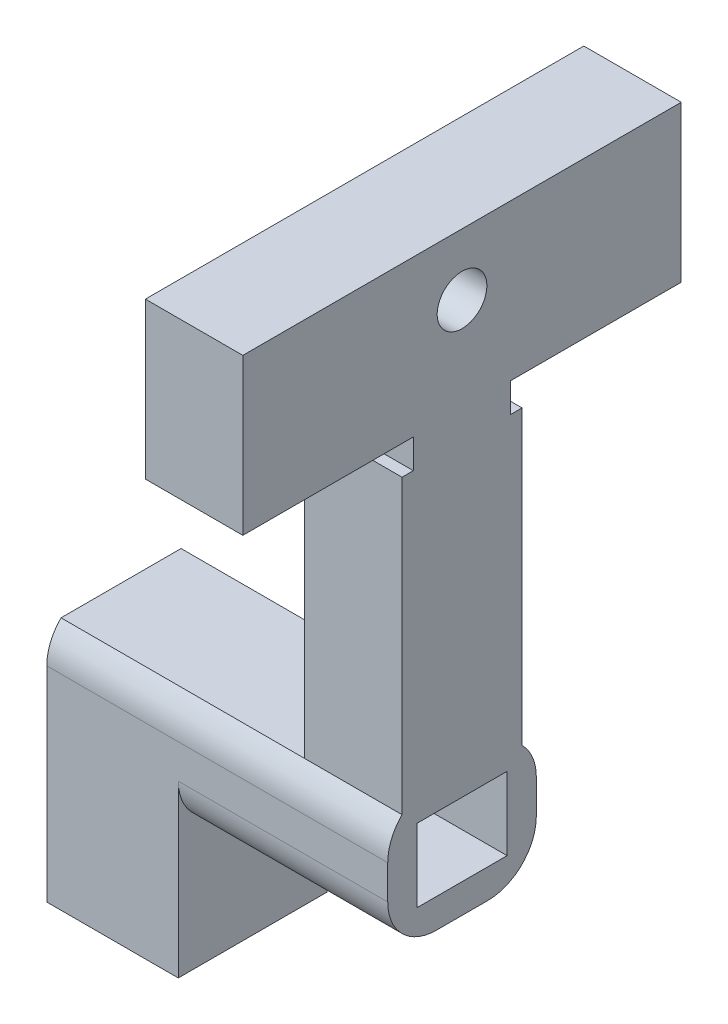
ISO-10303-21;
HEADER;
FILE_DESCRIPTION(('STEP AP214'),'2;1');
FILE_NAME('part.step','',(''),(''),'','','');
FILE_SCHEMA(('AUTOMOTIVE_DESIGN { 1 0 10303 214 1 1 1 1 }'));
ENDSEC;
DATA;
#1=APPLICATION_CONTEXT('core data for automotive mechanical design processes');
#2=APPLICATION_PROTOCOL_DEFINITION('international standard','automotive_design',2000,#1);
#3=PRODUCT_CONTEXT('',#1,'mechanical');
#4=PRODUCT('Part','Part','',(#3));
#5=PRODUCT_RELATED_PRODUCT_CATEGORY('part','',(#4));
#6=PRODUCT_DEFINITION_FORMATION('','',#4);
#7=PRODUCT_DEFINITION_CONTEXT('part definition',#1,'design');
#8=PRODUCT_DEFINITION('design','',#6,#7);
#9=PRODUCT_DEFINITION_SHAPE('','',#8);
#10=(LENGTH_UNIT() NAMED_UNIT(*) SI_UNIT(.MILLI.,.METRE.));
#11=(NAMED_UNIT(*) PLANE_ANGLE_UNIT() SI_UNIT($,.RADIAN.));
#12=(NAMED_UNIT(*) SI_UNIT($,.STERADIAN.) SOLID_ANGLE_UNIT());
#13=UNCERTAINTY_MEASURE_WITH_UNIT(LENGTH_MEASURE(1.E-05),#10,'distance_accuracy_value','');
#14=(GEOMETRIC_REPRESENTATION_CONTEXT(3) GLOBAL_UNCERTAINTY_ASSIGNED_CONTEXT((#13)) GLOBAL_UNIT_ASSIGNED_CONTEXT((#10,
#11,#12)) REPRESENTATION_CONTEXT('',''));
#15=CARTESIAN_POINT('',(0.,0.,0.));
#16=DIRECTION('',(0.,0.,1.));
#17=DIRECTION('',(1.,0.,0.));
#18=AXIS2_PLACEMENT_3D('',#15,#16,#17);
#19=CARTESIAN_POINT('',(10.,-13.5,0.));
#20=DIRECTION('',(0.,1.,0.));
#21=DIRECTION('',(0.,0.,1.));
#22=AXIS2_PLACEMENT_3D('',#19,#20,#21);
#23=PLANE('',#22);
#24=DIRECTION('',(0.,0.,-1.));
#25=VECTOR('',#24,1.);
#26=CARTESIAN_POINT('',(-35.,-13.5,15.25));
#27=LINE('',#26,#25);
#28=CARTESIAN_POINT('',(-35.,-13.5,13.75));
#29=VERTEX_POINT('',#28);
#30=CARTESIAN_POINT('',(-35.,-13.5,-13.75));
#31=VERTEX_POINT('',#30);
#32=EDGE_CURVE('E248',#29,#31,#27,.T.);
#33=ORIENTED_EDGE('',*,*,#32,.F.);
#34=DIRECTION('',(-1.,0.,0.));
#35=VECTOR('',#34,1.);
#36=CARTESIAN_POINT('',(-35.,-13.5,13.75));
#37=LINE('',#36,#35);
#38=CARTESIAN_POINT('',(-57.,-13.5,13.75));
#39=VERTEX_POINT('',#38);
#40=EDGE_CURVE('E284',#29,#39,#37,.T.);
#41=ORIENTED_EDGE('',*,*,#40,.T.);
#42=DIRECTION('',(0.,0.,1.));
#43=VECTOR('',#42,1.);
#44=CARTESIAN_POINT('',(-57.,-13.5,15.25));
#45=LINE('',#44,#43);
#46=CARTESIAN_POINT('',(-57.,-13.5,-13.75));
#47=VERTEX_POINT('',#46);
#48=EDGE_CURVE('E296',#47,#39,#45,.T.);
#49=ORIENTED_EDGE('',*,*,#48,.F.);
#50=DIRECTION('',(-1.,0.,0.));
#51=VECTOR('',#50,1.);
#52=CARTESIAN_POINT('',(-35.,-13.5,-13.75));
#53=LINE('',#52,#51);
#54=EDGE_CURVE('E273',#31,#47,#53,.T.);
#55=ORIENTED_EDGE('',*,*,#54,.F.);
#56=EDGE_LOOP('',(#33,#41,#49,#55));
#57=FACE_BOUND('',#56,.T.);
#58=ADVANCED_FACE('F50',(#57),#23,.F.);
#59=DIRECTION('',(-1.,0.,0.));
#60=VECTOR('',#59,1.);
#61=CARTESIAN_POINT('',(10.,-13.5,5.24999999999993));
#62=LINE('',#61,#60);
#63=CARTESIAN_POINT('',(10.,-13.5,5.24999999999993));
#64=VERTEX_POINT('',#63);
#65=CARTESIAN_POINT('',(-33.,-13.5,5.24999999999993));
#66=VERTEX_POINT('',#65);
#67=EDGE_CURVE('E540',#64,#66,#62,.T.);
#68=ORIENTED_EDGE('',*,*,#67,.T.);
#69=DIRECTION('',(0.,0.,-1.));
#70=VECTOR('',#69,1.);
#71=CARTESIAN_POINT('',(-33.,-13.5,0.));
#72=LINE('',#71,#70);
#73=CARTESIAN_POINT('',(-33.,-13.5,-5.25));
#74=VERTEX_POINT('',#73);
#75=EDGE_CURVE('E278',#66,#74,#72,.T.);
#76=ORIENTED_EDGE('',*,*,#75,.T.);
#77=DIRECTION('',(-1.,0.,0.));
#78=VECTOR('',#77,1.);
#79=CARTESIAN_POINT('',(10.,-13.5,-5.24999999999992));
#80=LINE('',#79,#78);
#81=CARTESIAN_POINT('',(10.,-13.5,-5.24999999999992));
#82=VERTEX_POINT('',#81);
#83=EDGE_CURVE('E534',#82,#74,#80,.T.);
#84=ORIENTED_EDGE('',*,*,#83,.F.);
#85=DIRECTION('',(0.,0.,-1.));
#86=VECTOR('',#85,1.);
#87=CARTESIAN_POINT('',(10.,-13.5,0.));
#88=LINE('',#87,#86);
#89=EDGE_CURVE('E515',#64,#82,#88,.T.);
#90=ORIENTED_EDGE('',*,*,#89,.F.);
#91=EDGE_LOOP('',(#68,#76,#84,#90));
#92=FACE_BOUND('',#91,.T.);
#93=ADVANCED_FACE('F595',(#92),#23,.F.);
#94=CARTESIAN_POINT('',(-57.,-38.5,15.25));
#95=DIRECTION('',(-1.,0.,0.));
#96=DIRECTION('',(0.,0.,1.));
#97=AXIS2_PLACEMENT_3D('',#94,#95,#96);
#98=PLANE('',#97);
#99=DIRECTION('',(0.,1.,0.));
#100=VECTOR('',#99,1.);
#101=CARTESIAN_POINT('',(-57.,-38.5,13.75));
#102=LINE('',#101,#100);
#103=CARTESIAN_POINT('',(-57.,-38.5,13.75));
#104=VERTEX_POINT('',#103);
#105=EDGE_CURVE('E288',#104,#39,#102,.T.);
#106=ORIENTED_EDGE('',*,*,#105,.F.);
#107=DIRECTION('',(0.,0.,1.));
#108=VECTOR('',#107,1.);
#109=CARTESIAN_POINT('',(-57.,-38.5,15.25));
#110=LINE('',#109,#108);
#111=CARTESIAN_POINT('',(-57.,-38.5,-13.75));
#112=VERTEX_POINT('',#111);
#113=EDGE_CURVE('E249',#112,#104,#110,.T.);
#114=ORIENTED_EDGE('',*,*,#113,.F.);
#115=DIRECTION('',(0.,-1.,0.));
#116=VECTOR('',#115,1.);
#117=CARTESIAN_POINT('',(-57.,-38.5,-13.75));
#118=LINE('',#117,#116);
#119=EDGE_CURVE('E286',#47,#112,#118,.T.);
#120=ORIENTED_EDGE('',*,*,#119,.F.);
#121=ORIENTED_EDGE('',*,*,#48,.T.);
#122=EDGE_LOOP('',(#106,#114,#120,#121));
#123=FACE_BOUND('',#122,.T.);
#124=ADVANCED_FACE('F602',(#123),#98,.F.);
#125=CARTESIAN_POINT('',(-10.,0.,0.));
#126=DIRECTION('',(1.,0.,0.));
#127=DIRECTION('',(0.,0.,-1.));
#128=AXIS2_PLACEMENT_3D('',#125,#126,#127);
#129=PLANE('',#128);
#130=CARTESIAN_POINT('',(-10.,95.9210678119076,0.));
#131=DIRECTION('',(1.,0.,0.));
#132=DIRECTION('',(0.,0.,-1.));
#133=AXIS2_PLACEMENT_3D('',#130,#131,#132);
#134=CIRCLE('',#133,5.1);
#135=CARTESIAN_POINT('',(-10.,95.9210678119076,-5.1));
#136=VERTEX_POINT('',#135);
#137=EDGE_CURVE('E368',#136,#136,#134,.T.);
#138=ORIENTED_EDGE('',*,*,#137,.T.);
#139=EDGE_LOOP('',(#138));
#140=FACE_BOUND('',#139,.T.);
#141=DIRECTION('',(0.,0.,-1.));
#142=VECTOR('',#141,1.);
#143=CARTESIAN_POINT('',(-10.,10.5710678118655,12.3210678118655));
#144=LINE('',#143,#142);
#145=CARTESIAN_POINT('',(-10.,10.5710678118655,12.3210678118655));
#146=VERTEX_POINT('',#145);
#147=CARTESIAN_POINT('',(-10.,10.5710678118655,-12.3210678118655));
#148=VERTEX_POINT('',#147);
#149=EDGE_CURVE('E338',#146,#148,#144,.T.);
#150=ORIENTED_EDGE('',*,*,#149,.F.);
#151=DIRECTION('',(0.,-1.,0.));
#152=VECTOR('',#151,1.);
#153=CARTESIAN_POINT('',(-10.,10.5710678118655,12.3210678118655));
#154=LINE('',#153,#152);
#155=CARTESIAN_POINT('',(-10.,70.5710678118655,12.3210678118655));
#156=VERTEX_POINT('',#155);
#157=EDGE_CURVE('E459',#156,#146,#154,.T.);
#158=ORIENTED_EDGE('',*,*,#157,.F.);
#159=DIRECTION('',(0.,0.,1.));
#160=VECTOR('',#159,1.);
#161=CARTESIAN_POINT('',(-10.,70.5710678118655,12.3210678118655));
#162=LINE('',#161,#160);
#163=CARTESIAN_POINT('',(-10.,70.5710678118655,10.));
#164=VERTEX_POINT('',#163);
#165=EDGE_CURVE('E453',#164,#156,#162,.T.);
#166=ORIENTED_EDGE('',*,*,#165,.F.);
#167=DIRECTION('',(0.,1.,0.));
#168=VECTOR('',#167,1.);
#169=CARTESIAN_POINT('',(-9.99999999999999,70.5710678118655,10.));
#170=LINE('',#169,#168);
#171=CARTESIAN_POINT('',(-9.99999999999999,76.5710678118655,10.));
#172=VERTEX_POINT('',#171);
#173=EDGE_CURVE('E395',#164,#172,#170,.T.);
#174=ORIENTED_EDGE('',*,*,#173,.T.);
#175=DIRECTION('',(0.,0.,1.));
#176=VECTOR('',#175,1.);
#177=CARTESIAN_POINT('',(-9.99999999999999,76.5710678118655,45.));
#178=LINE('',#177,#176);
#179=CARTESIAN_POINT('',(-9.99999999999999,76.5710678118655,45.));
#180=VERTEX_POINT('',#179);
#181=EDGE_CURVE('E386',#172,#180,#178,.T.);
#182=ORIENTED_EDGE('',*,*,#181,.T.);
#183=DIRECTION('',(0.,1.,0.));
#184=VECTOR('',#183,1.);
#185=CARTESIAN_POINT('',(-9.99999999999999,76.5710678118655,45.));
#186=LINE('',#185,#184);
#187=CARTESIAN_POINT('',(-9.99999999999999,108.571067811866,45.));
#188=VERTEX_POINT('',#187);
#189=EDGE_CURVE('E387',#180,#188,#186,.T.);
#190=ORIENTED_EDGE('',*,*,#189,.T.);
#191=DIRECTION('',(0.,0.,-1.));
#192=VECTOR('',#191,1.);
#193=CARTESIAN_POINT('',(-9.99999999999999,108.571067811866,45.));
#194=LINE('',#193,#192);
#195=CARTESIAN_POINT('',(-9.99999999999999,108.571067811866,-45.));
#196=VERTEX_POINT('',#195);
#197=EDGE_CURVE('E384',#188,#196,#194,.T.);
#198=ORIENTED_EDGE('',*,*,#197,.T.);
#199=DIRECTION('',(0.,-1.,0.));
#200=VECTOR('',#199,1.);
#201=CARTESIAN_POINT('',(-9.99999999999999,76.5710678118655,-45.));
#202=LINE('',#201,#200);
#203=CARTESIAN_POINT('',(-9.99999999999999,76.5710678118655,-45.));
#204=VERTEX_POINT('',#203);
#205=EDGE_CURVE('E378',#196,#204,#202,.T.);
#206=ORIENTED_EDGE('',*,*,#205,.T.);
#207=DIRECTION('',(0.,0.,1.));
#208=VECTOR('',#207,1.);
#209=CARTESIAN_POINT('',(-9.99999999999999,76.5710678118655,-10.));
#210=LINE('',#209,#208);
#211=CARTESIAN_POINT('',(-9.99999999999999,76.5710678118655,-10.));
#212=VERTEX_POINT('',#211);
#213=EDGE_CURVE('E376',#204,#212,#210,.T.);
#214=ORIENTED_EDGE('',*,*,#213,.T.);
#215=DIRECTION('',(0.,-1.,0.));
#216=VECTOR('',#215,1.);
#217=CARTESIAN_POINT('',(-9.99999999999999,70.5710678118655,-10.));
#218=LINE('',#217,#216);
#219=CARTESIAN_POINT('',(-10.,70.5710678118655,-10.));
#220=VERTEX_POINT('',#219);
#221=EDGE_CURVE('E394',#212,#220,#218,.T.);
#222=ORIENTED_EDGE('',*,*,#221,.T.);
#223=CARTESIAN_POINT('',(-10.,70.5710678118655,-12.3210678118655));
#224=VERTEX_POINT('',#223);
#225=EDGE_CURVE('E460',#224,#220,#162,.T.);
#226=ORIENTED_EDGE('',*,*,#225,.F.);
#227=DIRECTION('',(0.,1.,0.));
#228=VECTOR('',#227,1.);
#229=CARTESIAN_POINT('',(-10.,10.5710678118655,-12.3210678118655));
#230=LINE('',#229,#228);
#231=EDGE_CURVE('E452',#148,#224,#230,.T.);
#232=ORIENTED_EDGE('',*,*,#231,.F.);
#233=EDGE_LOOP('',(#150,#158,#166,#174,#182,#190,#198,#206,#214,#222,#226,#232));
#234=FACE_BOUND('',#233,.T.);
#235=ADVANCED_FACE('F634',(#140,#234),#129,.F.);
#236=CARTESIAN_POINT('',(-10.,70.5710678118655,12.3210678118655));
#237=DIRECTION('',(0.,1.,0.));
#238=DIRECTION('',(0.,0.,1.));
#239=AXIS2_PLACEMENT_3D('',#236,#237,#238);
#240=PLANE('',#239);
#241=ORIENTED_EDGE('',*,*,#225,.T.);
#242=DIRECTION('',(1.,0.,0.));
#243=VECTOR('',#242,1.);
#244=CARTESIAN_POINT('',(-107.693397934559,70.5710678118655,-10.));
#245=LINE('',#244,#243);
#246=CARTESIAN_POINT('',(10.,70.5710678118655,-10.));
#247=VERTEX_POINT('',#246);
#248=EDGE_CURVE('E421',#220,#247,#245,.T.);
#249=ORIENTED_EDGE('',*,*,#248,.T.);
#250=DIRECTION('',(0.,0.,1.));
#251=VECTOR('',#250,1.);
#252=CARTESIAN_POINT('',(10.,70.5710678118655,12.3210678118655));
#253=LINE('',#252,#251);
#254=CARTESIAN_POINT('',(10.,70.5710678118655,-12.3210678118655));
#255=VERTEX_POINT('',#254);
#256=EDGE_CURVE('E469',#255,#247,#253,.T.);
#257=ORIENTED_EDGE('',*,*,#256,.F.);
#258=DIRECTION('',(1.,0.,0.));
#259=VECTOR('',#258,1.);
#260=CARTESIAN_POINT('',(-10.,70.5710678118655,-12.3210678118655));
#261=LINE('',#260,#259);
#262=EDGE_CURVE('E481',#224,#255,#261,.T.);
#263=ORIENTED_EDGE('',*,*,#262,.F.);
#264=EDGE_LOOP('',(#241,#249,#257,#263));
#265=FACE_BOUND('',#264,.T.);
#266=ADVANCED_FACE('F611',(#265),#240,.T.);
#267=CARTESIAN_POINT('',(10.,3.5,5.25));
#268=DIRECTION('',(-1.,0.,0.));
#269=DIRECTION('',(0.,0.,1.));
#270=AXIS2_PLACEMENT_3D('',#267,#268,#269);
#271=CYLINDRICAL_SURFACE('',#270,10.);
#272=CARTESIAN_POINT('',(10.,3.5,5.25));
#273=DIRECTION('',(1.,0.,0.));
#274=DIRECTION('',(0.,0.,-1.));
#275=AXIS2_PLACEMENT_3D('',#272,#273,#274);
#276=CIRCLE('',#275,10.);
#277=CARTESIAN_POINT('',(10.,10.5710678118655,12.3210678118655));
#278=VERTEX_POINT('',#277);
#279=CARTESIAN_POINT('',(10.,3.49999999999993,15.25));
#280=VERTEX_POINT('',#279);
#281=EDGE_CURVE('E503',#278,#280,#276,.T.);
#282=ORIENTED_EDGE('',*,*,#281,.F.);
#283=DIRECTION('',(1.,0.,0.));
#284=VECTOR('',#283,1.);
#285=CARTESIAN_POINT('',(-10.,10.5710678118655,12.3210678118655));
#286=LINE('',#285,#284);
#287=EDGE_CURVE('E476',#146,#278,#286,.T.);
#288=ORIENTED_EDGE('',*,*,#287,.F.);
#289=DIRECTION('',(1.,0.,0.));
#290=VECTOR('',#289,1.);
#291=CARTESIAN_POINT('',(-60.,10.5710678118655,12.3210678118655));
#292=LINE('',#291,#290);
#293=CARTESIAN_POINT('',(-60.,10.5710678118655,12.3210678118655));
#294=VERTEX_POINT('',#293);
#295=EDGE_CURVE('E361',#294,#146,#292,.T.);
#296=ORIENTED_EDGE('',*,*,#295,.F.);
#297=CARTESIAN_POINT('',(-60.,3.5,5.25));
#298=DIRECTION('',(-1.,0.,0.));
#299=DIRECTION('',(0.,0.,1.));
#300=AXIS2_PLACEMENT_3D('',#297,#298,#299);
#301=CIRCLE('',#300,10.);
#302=CARTESIAN_POINT('',(-60.,3.49999999999993,15.25));
#303=VERTEX_POINT('',#302);
#304=EDGE_CURVE('E349',#303,#294,#301,.T.);
#305=ORIENTED_EDGE('',*,*,#304,.F.);
#306=DIRECTION('',(-1.,0.,0.));
#307=VECTOR('',#306,1.);
#308=CARTESIAN_POINT('',(10.,3.49999999999993,15.25));
#309=LINE('',#308,#307);
#310=EDGE_CURVE('E11',#280,#303,#309,.T.);
#311=ORIENTED_EDGE('',*,*,#310,.F.);
#312=EDGE_LOOP('',(#282,#288,#296,#305,#311));
#313=FACE_BOUND('',#312,.T.);
#314=ADVANCED_FACE('F614',(#313),#271,.T.);
#315=CARTESIAN_POINT('',(10.,0.,15.25));
#316=DIRECTION('',(0.,0.,-1.));
#317=DIRECTION('',(-1.,0.,0.));
#318=AXIS2_PLACEMENT_3D('',#315,#316,#317);
#319=PLANE('',#318);
#320=DIRECTION('',(-1.,0.,0.));
#321=VECTOR('',#320,1.);
#322=CARTESIAN_POINT('',(-60.,-38.5,15.25));
#323=LINE('',#322,#321);
#324=CARTESIAN_POINT('',(-33.,-38.5,15.25));
#325=VERTEX_POINT('',#324);
#326=CARTESIAN_POINT('',(-60.,-38.5,15.25));
#327=VERTEX_POINT('',#326);
#328=EDGE_CURVE('E238',#325,#327,#323,.T.);
#329=ORIENTED_EDGE('',*,*,#328,.F.);
#330=DIRECTION('',(0.,-1.,0.));
#331=VECTOR('',#330,1.);
#332=CARTESIAN_POINT('',(-33.,0.,15.25));
#333=LINE('',#332,#331);
#334=CARTESIAN_POINT('',(-33.,-3.49999999999993,15.25));
#335=VERTEX_POINT('',#334);
#336=EDGE_CURVE('E241',#335,#325,#333,.T.);
#337=ORIENTED_EDGE('',*,*,#336,.F.);
#338=DIRECTION('',(-1.,0.,0.));
#339=VECTOR('',#338,1.);
#340=CARTESIAN_POINT('',(10.,-3.49999999999993,15.25));
#341=LINE('',#340,#339);
#342=CARTESIAN_POINT('',(10.,-3.49999999999993,15.25));
#343=VERTEX_POINT('',#342);
#344=EDGE_CURVE('E60',#343,#335,#341,.T.);
#345=ORIENTED_EDGE('',*,*,#344,.F.);
#346=DIRECTION('',(0.,-1.,0.));
#347=VECTOR('',#346,1.);
#348=CARTESIAN_POINT('',(10.,0.,15.25));
#349=LINE('',#348,#347);
#350=EDGE_CURVE('E506',#280,#343,#349,.T.);
#351=ORIENTED_EDGE('',*,*,#350,.F.);
#352=ORIENTED_EDGE('',*,*,#310,.T.);
#353=DIRECTION('',(0.,1.,0.));
#354=VECTOR('',#353,1.);
#355=CARTESIAN_POINT('',(-60.,-3.49999999999993,15.25));
#356=LINE('',#355,#354);
#357=EDGE_CURVE('E243',#327,#303,#356,.T.);
#358=ORIENTED_EDGE('',*,*,#357,.F.);
#359=EDGE_LOOP('',(#329,#337,#345,#351,#352,#358));
#360=FACE_BOUND('',#359,.T.);
#361=ADVANCED_FACE('F239',(#360),#319,.F.);
#362=CARTESIAN_POINT('',(10.,-3.5,5.25));
#363=DIRECTION('',(-1.,0.,0.));
#364=DIRECTION('',(0.,0.,1.));
#365=AXIS2_PLACEMENT_3D('',#362,#363,#364);
#366=CYLINDRICAL_SURFACE('',#365,10.);
#367=CARTESIAN_POINT('',(-33.,-3.5,5.25));
#368=DIRECTION('',(1.,0.,0.));
#369=DIRECTION('',(0.,0.,-1.));
#370=AXIS2_PLACEMENT_3D('',#367,#368,#369);
#371=CIRCLE('',#370,10.);
#372=EDGE_CURVE('E67',#66,#335,#371,.F.);
#373=ORIENTED_EDGE('',*,*,#372,.F.);
#374=ORIENTED_EDGE('',*,*,#67,.F.);
#375=CARTESIAN_POINT('',(10.,-3.5,5.25));
#376=DIRECTION('',(1.,0.,0.));
#377=DIRECTION('',(0.,0.,-1.));
#378=AXIS2_PLACEMENT_3D('',#375,#376,#377);
#379=CIRCLE('',#378,10.);
#380=EDGE_CURVE('E508',#64,#343,#379,.F.);
#381=ORIENTED_EDGE('',*,*,#380,.T.);
#382=ORIENTED_EDGE('',*,*,#344,.T.);
#383=EDGE_LOOP('',(#373,#374,#381,#382));
#384=FACE_BOUND('',#383,.T.);
#385=ADVANCED_FACE('F610',(#384),#366,.T.);
#386=CARTESIAN_POINT('',(10.,-3.5,-5.25));
#387=DIRECTION('',(-1.,0.,0.));
#388=DIRECTION('',(0.,0.,1.));
#389=AXIS2_PLACEMENT_3D('',#386,#387,#388);
#390=CYLINDRICAL_SURFACE('',#389,10.);
#391=CARTESIAN_POINT('',(-33.,-3.5,-5.25));
#392=DIRECTION('',(1.,0.,0.));
#393=DIRECTION('',(0.,0.,-1.));
#394=AXIS2_PLACEMENT_3D('',#391,#392,#393);
#395=CIRCLE('',#394,10.);
#396=CARTESIAN_POINT('',(-33.,-3.49999999999993,-15.25));
#397=VERTEX_POINT('',#396);
#398=EDGE_CURVE('E270',#74,#397,#395,.T.);
#399=ORIENTED_EDGE('',*,*,#398,.T.);
#400=DIRECTION('',(-1.,0.,0.));
#401=VECTOR('',#400,1.);
#402=CARTESIAN_POINT('',(10.,-3.49999999999993,-15.25));
#403=LINE('',#402,#401);
#404=CARTESIAN_POINT('',(10.,-3.49999999999993,-15.25));
#405=VERTEX_POINT('',#404);
#406=EDGE_CURVE('E526',#405,#397,#403,.T.);
#407=ORIENTED_EDGE('',*,*,#406,.F.);
#408=CARTESIAN_POINT('',(10.,-3.5,-5.25));
#409=DIRECTION('',(1.,0.,0.));
#410=DIRECTION('',(0.,0.,-1.));
#411=AXIS2_PLACEMENT_3D('',#408,#409,#410);
#412=CIRCLE('',#411,10.);
#413=EDGE_CURVE('E513',#405,#82,#412,.F.);
#414=ORIENTED_EDGE('',*,*,#413,.T.);
#415=ORIENTED_EDGE('',*,*,#83,.T.);
#416=EDGE_LOOP('',(#399,#407,#414,#415));
#417=FACE_BOUND('',#416,.T.);
#418=ADVANCED_FACE('F603',(#417),#390,.T.);
#419=CARTESIAN_POINT('',(10.,0.,-15.25));
#420=DIRECTION('',(0.,0.,-1.));
#421=DIRECTION('',(-1.,0.,0.));
#422=AXIS2_PLACEMENT_3D('',#419,#420,#421);
#423=PLANE('',#422);
#424=ORIENTED_EDGE('',*,*,#406,.T.);
#425=DIRECTION('',(0.,1.,0.));
#426=VECTOR('',#425,1.);
#427=CARTESIAN_POINT('',(-33.,0.,-15.25));
#428=LINE('',#427,#426);
#429=CARTESIAN_POINT('',(-33.,-38.5,-15.25));
#430=VERTEX_POINT('',#429);
#431=EDGE_CURVE('E268',#430,#397,#428,.T.);
#432=ORIENTED_EDGE('',*,*,#431,.F.);
#433=DIRECTION('',(1.,0.,0.));
#434=VECTOR('',#433,1.);
#435=CARTESIAN_POINT('',(-60.,-38.5,-15.25));
#436=LINE('',#435,#434);
#437=CARTESIAN_POINT('',(-60.,-38.5,-15.25));
#438=VERTEX_POINT('',#437);
#439=EDGE_CURVE('E263',#438,#430,#436,.T.);
#440=ORIENTED_EDGE('',*,*,#439,.F.);
#441=DIRECTION('',(0.,-1.,0.));
#442=VECTOR('',#441,1.);
#443=CARTESIAN_POINT('',(-60.,3.49999999999993,-15.25));
#444=LINE('',#443,#442);
#445=CARTESIAN_POINT('',(-60.,3.49999999999993,-15.25));
#446=VERTEX_POINT('',#445);
#447=EDGE_CURVE('E343',#446,#438,#444,.T.);
#448=ORIENTED_EDGE('',*,*,#447,.F.);
#449=DIRECTION('',(-1.,0.,0.));
#450=VECTOR('',#449,1.);
#451=CARTESIAN_POINT('',(10.,3.49999999999993,-15.25));
#452=LINE('',#451,#450);
#453=CARTESIAN_POINT('',(10.,3.49999999999993,-15.25));
#454=VERTEX_POINT('',#453);
#455=EDGE_CURVE('E529',#454,#446,#452,.T.);
#456=ORIENTED_EDGE('',*,*,#455,.F.);
#457=DIRECTION('',(0.,-1.,0.));
#458=VECTOR('',#457,1.);
#459=CARTESIAN_POINT('',(10.,0.,-15.25));
#460=LINE('',#459,#458);
#461=EDGE_CURVE('E516',#454,#405,#460,.T.);
#462=ORIENTED_EDGE('',*,*,#461,.T.);
#463=EDGE_LOOP('',(#424,#432,#440,#448,#456,#462));
#464=FACE_BOUND('',#463,.T.);
#465=ADVANCED_FACE('F624',(#464),#423,.T.);
#466=CARTESIAN_POINT('',(10.,-7.5,0.));
#467=DIRECTION('',(0.,1.,0.));
#468=DIRECTION('',(0.,0.,1.));
#469=AXIS2_PLACEMENT_3D('',#466,#467,#468);
#470=PLANE('',#469);
#471=DIRECTION('',(-1.,0.,0.));
#472=VECTOR('',#471,1.);
#473=CARTESIAN_POINT('',(10.,-7.5,-9.25));
#474=LINE('',#473,#472);
#475=CARTESIAN_POINT('',(10.,-7.5,-9.25));
#476=VERTEX_POINT('',#475);
#477=CARTESIAN_POINT('',(-60.,-7.5,-9.25));
#478=VERTEX_POINT('',#477);
#479=EDGE_CURVE('E528',#476,#478,#474,.T.);
#480=ORIENTED_EDGE('',*,*,#479,.T.);
#481=DIRECTION('',(0.,0.,1.));
#482=VECTOR('',#481,1.);
#483=CARTESIAN_POINT('',(-60.,-7.5,9.25));
#484=LINE('',#483,#482);
#485=CARTESIAN_POINT('',(-60.,-7.5,9.25));
#486=VERTEX_POINT('',#485);
#487=EDGE_CURVE('E332',#478,#486,#484,.T.);
#488=ORIENTED_EDGE('',*,*,#487,.T.);
#489=DIRECTION('',(-1.,0.,0.));
#490=VECTOR('',#489,1.);
#491=CARTESIAN_POINT('',(10.,-7.5,9.25));
#492=LINE('',#491,#490);
#493=CARTESIAN_POINT('',(10.,-7.5,9.25));
#494=VERTEX_POINT('',#493);
#495=EDGE_CURVE('E51',#494,#486,#492,.T.);
#496=ORIENTED_EDGE('',*,*,#495,.F.);
#497=DIRECTION('',(0.,0.,-1.));
#498=VECTOR('',#497,1.);
#499=CARTESIAN_POINT('',(10.,-7.5,0.));
#500=LINE('',#499,#498);
#501=EDGE_CURVE('E479',#494,#476,#500,.T.);
#502=ORIENTED_EDGE('',*,*,#501,.T.);
#503=EDGE_LOOP('',(#480,#488,#496,#502));
#504=FACE_BOUND('',#503,.T.);
#505=ADVANCED_FACE('F47',(#504),#470,.T.);
#506=CARTESIAN_POINT('',(10.,0.,9.25));
#507=DIRECTION('',(0.,0.,-1.));
#508=DIRECTION('',(-1.,0.,0.));
#509=AXIS2_PLACEMENT_3D('',#506,#507,#508);
#510=PLANE('',#509);
#511=DIRECTION('',(0.,1.,0.));
#512=VECTOR('',#511,1.);
#513=CARTESIAN_POINT('',(-60.,7.5,9.25));
#514=LINE('',#513,#512);
#515=CARTESIAN_POINT('',(-60.,7.5,9.25));
#516=VERTEX_POINT('',#515);
#517=EDGE_CURVE('E340',#486,#516,#514,.T.);
#518=ORIENTED_EDGE('',*,*,#517,.T.);
#519=DIRECTION('',(-1.,0.,0.));
#520=VECTOR('',#519,1.);
#521=CARTESIAN_POINT('',(10.,7.5,9.25));
#522=LINE('',#521,#520);
#523=CARTESIAN_POINT('',(10.,7.5,9.25));
#524=VERTEX_POINT('',#523);
#525=EDGE_CURVE('E549',#524,#516,#522,.T.);
#526=ORIENTED_EDGE('',*,*,#525,.F.);
#527=DIRECTION('',(0.,-1.,0.));
#528=VECTOR('',#527,1.);
#529=CARTESIAN_POINT('',(10.,0.,9.25));
#530=LINE('',#529,#528);
#531=EDGE_CURVE('E491',#524,#494,#530,.T.);
#532=ORIENTED_EDGE('',*,*,#531,.T.);
#533=ORIENTED_EDGE('',*,*,#495,.T.);
#534=EDGE_LOOP('',(#518,#526,#532,#533));
#535=FACE_BOUND('',#534,.T.);
#536=ADVANCED_FACE('F554',(#535),#510,.T.);
#537=CARTESIAN_POINT('',(10.,7.5,0.));
#538=DIRECTION('',(0.,1.,0.));
#539=DIRECTION('',(0.,0.,1.));
#540=AXIS2_PLACEMENT_3D('',#537,#538,#539);
#541=PLANE('',#540);
#542=ORIENTED_EDGE('',*,*,#525,.T.);
#543=DIRECTION('',(0.,0.,-1.));
#544=VECTOR('',#543,1.);
#545=CARTESIAN_POINT('',(-60.,7.5,9.25));
#546=LINE('',#545,#544);
#547=CARTESIAN_POINT('',(-60.,7.5,-9.25));
#548=VERTEX_POINT('',#547);
#549=EDGE_CURVE('E326',#516,#548,#546,.T.);
#550=ORIENTED_EDGE('',*,*,#549,.T.);
#551=DIRECTION('',(-1.,0.,0.));
#552=VECTOR('',#551,1.);
#553=CARTESIAN_POINT('',(10.,7.5,-9.25));
#554=LINE('',#553,#552);
#555=CARTESIAN_POINT('',(10.,7.5,-9.25));
#556=VERTEX_POINT('',#555);
#557=EDGE_CURVE('E544',#556,#548,#554,.T.);
#558=ORIENTED_EDGE('',*,*,#557,.F.);
#559=DIRECTION('',(0.,0.,-1.));
#560=VECTOR('',#559,1.);
#561=CARTESIAN_POINT('',(10.,7.5,0.));
#562=LINE('',#561,#560);
#563=EDGE_CURVE('E500',#524,#556,#562,.T.);
#564=ORIENTED_EDGE('',*,*,#563,.F.);
#565=EDGE_LOOP('',(#542,#550,#558,#564));
#566=FACE_BOUND('',#565,.T.);
#567=ADVANCED_FACE('F570',(#566),#541,.F.);
#568=CARTESIAN_POINT('',(10.,0.,-9.25));
#569=DIRECTION('',(0.,0.,-1.));
#570=DIRECTION('',(0.,1.,0.));
#571=AXIS2_PLACEMENT_3D('',#568,#569,#570);
#572=PLANE('',#571);
#573=DIRECTION('',(0.,-1.,0.));
#574=VECTOR('',#573,1.);
#575=CARTESIAN_POINT('',(-60.,7.5,-9.25));
#576=LINE('',#575,#574);
#577=EDGE_CURVE('E329',#548,#478,#576,.T.);
#578=ORIENTED_EDGE('',*,*,#577,.T.);
#579=ORIENTED_EDGE('',*,*,#479,.F.);
#580=DIRECTION('',(0.,-1.,0.));
#581=VECTOR('',#580,1.);
#582=CARTESIAN_POINT('',(10.,0.,-9.25));
#583=LINE('',#582,#581);
#584=EDGE_CURVE('E499',#556,#476,#583,.T.);
#585=ORIENTED_EDGE('',*,*,#584,.F.);
#586=ORIENTED_EDGE('',*,*,#557,.T.);
#587=EDGE_LOOP('',(#578,#579,#585,#586));
#588=FACE_BOUND('',#587,.T.);
#589=ADVANCED_FACE('F569',(#588),#572,.F.);
#590=CARTESIAN_POINT('',(10.,3.5,-5.25));
#591=DIRECTION('',(-1.,0.,0.));
#592=DIRECTION('',(0.,0.,1.));
#593=AXIS2_PLACEMENT_3D('',#590,#591,#592);
#594=CYLINDRICAL_SURFACE('',#593,10.);
#595=DIRECTION('',(1.,0.,0.));
#596=VECTOR('',#595,1.);
#597=CARTESIAN_POINT('',(-10.,10.5710678118655,-12.3210678118655));
#598=LINE('',#597,#596);
#599=CARTESIAN_POINT('',(10.,10.5710678118655,-12.3210678118655));
#600=VERTEX_POINT('',#599);
#601=EDGE_CURVE('E465',#148,#600,#598,.T.);
#602=ORIENTED_EDGE('',*,*,#601,.T.);
#603=CARTESIAN_POINT('',(10.,3.5,-5.25));
#604=DIRECTION('',(1.,0.,0.));
#605=DIRECTION('',(0.,0.,-1.));
#606=AXIS2_PLACEMENT_3D('',#603,#604,#605);
#607=CIRCLE('',#606,10.);
#608=EDGE_CURVE('E522',#600,#454,#607,.F.);
#609=ORIENTED_EDGE('',*,*,#608,.T.);
#610=ORIENTED_EDGE('',*,*,#455,.T.);
#611=CARTESIAN_POINT('',(-60.,3.5,-5.25));
#612=DIRECTION('',(-1.,0.,0.));
#613=DIRECTION('',(0.,0.,1.));
#614=AXIS2_PLACEMENT_3D('',#611,#612,#613);
#615=CIRCLE('',#614,10.);
#616=CARTESIAN_POINT('',(-60.,10.5710678118655,-12.3210678118655));
#617=VERTEX_POINT('',#616);
#618=EDGE_CURVE('E342',#617,#446,#615,.T.);
#619=ORIENTED_EDGE('',*,*,#618,.F.);
#620=DIRECTION('',(1.,0.,0.));
#621=VECTOR('',#620,1.);
#622=CARTESIAN_POINT('',(-60.,10.5710678118655,-12.3210678118655));
#623=LINE('',#622,#621);
#624=EDGE_CURVE('E358',#617,#148,#623,.T.);
#625=ORIENTED_EDGE('',*,*,#624,.T.);
#626=EDGE_LOOP('',(#602,#609,#610,#619,#625));
#627=FACE_BOUND('',#626,.T.);
#628=ADVANCED_FACE('F574',(#627),#594,.T.);
#629=CARTESIAN_POINT('',(10.,0.,0.));
#630=DIRECTION('',(1.,0.,0.));
#631=DIRECTION('',(0.,0.,-1.));
#632=AXIS2_PLACEMENT_3D('',#629,#630,#631);
#633=PLANE('',#632);
#634=CARTESIAN_POINT('',(10.,95.9210678119076,0.));
#635=DIRECTION('',(1.,0.,0.));
#636=DIRECTION('',(0.,0.,-1.));
#637=AXIS2_PLACEMENT_3D('',#634,#635,#636);
#638=CIRCLE('',#637,5.1);
#639=CARTESIAN_POINT('',(10.,95.9210678119076,-5.1));
#640=VERTEX_POINT('',#639);
#641=EDGE_CURVE('E370',#640,#640,#638,.T.);
#642=ORIENTED_EDGE('',*,*,#641,.F.);
#643=EDGE_LOOP('',(#642));
#644=FACE_BOUND('',#643,.T.);
#645=DIRECTION('',(0.,-1.,0.));
#646=VECTOR('',#645,1.);
#647=CARTESIAN_POINT('',(10.,10.5710678118655,12.3210678118655));
#648=LINE('',#647,#646);
#649=CARTESIAN_POINT('',(10.,70.5710678118655,12.3210678118655));
#650=VERTEX_POINT('',#649);
#651=EDGE_CURVE('E456',#650,#278,#648,.T.);
#652=ORIENTED_EDGE('',*,*,#651,.T.);
#653=ORIENTED_EDGE('',*,*,#281,.T.);
#654=ORIENTED_EDGE('',*,*,#350,.T.);
#655=ORIENTED_EDGE('',*,*,#380,.F.);
#656=ORIENTED_EDGE('',*,*,#89,.T.);
#657=ORIENTED_EDGE('',*,*,#413,.F.);
#658=ORIENTED_EDGE('',*,*,#461,.F.);
#659=ORIENTED_EDGE('',*,*,#608,.F.);
#660=DIRECTION('',(0.,1.,0.));
#661=VECTOR('',#660,1.);
#662=CARTESIAN_POINT('',(10.,10.5710678118655,-12.3210678118655));
#663=LINE('',#662,#661);
#664=EDGE_CURVE('E448',#600,#255,#663,.T.);
#665=ORIENTED_EDGE('',*,*,#664,.T.);
#666=ORIENTED_EDGE('',*,*,#256,.T.);
#667=DIRECTION('',(0.,1.,0.));
#668=VECTOR('',#667,1.);
#669=CARTESIAN_POINT('',(10.,70.5710678118655,-10.));
#670=LINE('',#669,#668);
#671=CARTESIAN_POINT('',(10.,76.5710678118655,-10.));
#672=VERTEX_POINT('',#671);
#673=EDGE_CURVE('E375',#247,#672,#670,.T.);
#674=ORIENTED_EDGE('',*,*,#673,.T.);
#675=DIRECTION('',(0.,0.,-1.));
#676=VECTOR('',#675,1.);
#677=CARTESIAN_POINT('',(10.,76.5710678118655,-10.));
#678=LINE('',#677,#676);
#679=CARTESIAN_POINT('',(10.,76.5710678118655,-45.));
#680=VERTEX_POINT('',#679);
#681=EDGE_CURVE('E400',#672,#680,#678,.T.);
#682=ORIENTED_EDGE('',*,*,#681,.T.);
#683=DIRECTION('',(0.,1.,0.));
#684=VECTOR('',#683,1.);
#685=CARTESIAN_POINT('',(10.,76.5710678118655,-45.));
#686=LINE('',#685,#684);
#687=CARTESIAN_POINT('',(10.,108.571067811866,-45.));
#688=VERTEX_POINT('',#687);
#689=EDGE_CURVE('E401',#680,#688,#686,.T.);
#690=ORIENTED_EDGE('',*,*,#689,.T.);
#691=DIRECTION('',(0.,0.,1.));
#692=VECTOR('',#691,1.);
#693=CARTESIAN_POINT('',(10.,108.571067811866,45.));
#694=LINE('',#693,#692);
#695=CARTESIAN_POINT('',(10.,108.571067811866,45.));
#696=VERTEX_POINT('',#695);
#697=EDGE_CURVE('E410',#688,#696,#694,.T.);
#698=ORIENTED_EDGE('',*,*,#697,.T.);
#699=DIRECTION('',(0.,-1.,0.));
#700=VECTOR('',#699,1.);
#701=CARTESIAN_POINT('',(10.,76.5710678118655,45.));
#702=LINE('',#701,#700);
#703=CARTESIAN_POINT('',(10.,76.5710678118655,45.));
#704=VERTEX_POINT('',#703);
#705=EDGE_CURVE('E411',#696,#704,#702,.T.);
#706=ORIENTED_EDGE('',*,*,#705,.T.);
#707=DIRECTION('',(0.,0.,-1.));
#708=VECTOR('',#707,1.);
#709=CARTESIAN_POINT('',(10.,76.5710678118655,45.));
#710=LINE('',#709,#708);
#711=CARTESIAN_POINT('',(10.,76.5710678118655,10.));
#712=VERTEX_POINT('',#711);
#713=EDGE_CURVE('E414',#704,#712,#710,.T.);
#714=ORIENTED_EDGE('',*,*,#713,.T.);
#715=DIRECTION('',(0.,-1.,0.));
#716=VECTOR('',#715,1.);
#717=CARTESIAN_POINT('',(10.,70.5710678118655,10.));
#718=LINE('',#717,#716);
#719=CARTESIAN_POINT('',(10.,70.5710678118655,10.));
#720=VERTEX_POINT('',#719);
#721=EDGE_CURVE('E420',#712,#720,#718,.T.);
#722=ORIENTED_EDGE('',*,*,#721,.T.);
#723=EDGE_CURVE('E466',#720,#650,#253,.T.);
#724=ORIENTED_EDGE('',*,*,#723,.T.);
#725=EDGE_LOOP('',(#652,#653,#654,#655,#656,#657,#658,#659,#665,#666,#674,#682,#690,#698,#706,
#714,#722,#724));
#726=FACE_BOUND('',#725,.T.);
#727=ORIENTED_EDGE('',*,*,#501,.F.);
#728=ORIENTED_EDGE('',*,*,#531,.F.);
#729=ORIENTED_EDGE('',*,*,#563,.T.);
#730=ORIENTED_EDGE('',*,*,#584,.T.);
#731=EDGE_LOOP('',(#727,#728,#729,#730));
#732=FACE_BOUND('',#731,.T.);
#733=ADVANCED_FACE('F575',(#644,#726,#732),#633,.T.);
#734=CARTESIAN_POINT('',(-10.,10.5710678118655,12.3210678118655));
#735=DIRECTION('',(0.,0.,1.));
#736=DIRECTION('',(0.,-1.,0.));
#737=AXIS2_PLACEMENT_3D('',#734,#735,#736);
#738=PLANE('',#737);
#739=ORIENTED_EDGE('',*,*,#651,.F.);
#740=DIRECTION('',(1.,0.,0.));
#741=VECTOR('',#740,1.);
#742=CARTESIAN_POINT('',(-10.,70.5710678118655,12.3210678118655));
#743=LINE('',#742,#741);
#744=EDGE_CURVE('E483',#156,#650,#743,.T.);
#745=ORIENTED_EDGE('',*,*,#744,.F.);
#746=ORIENTED_EDGE('',*,*,#157,.T.);
#747=ORIENTED_EDGE('',*,*,#287,.T.);
#748=EDGE_LOOP('',(#739,#745,#746,#747));
#749=FACE_BOUND('',#748,.T.);
#750=ADVANCED_FACE('F573',(#749),#738,.T.);
#751=DIRECTION('',(1.,0.,0.));
#752=VECTOR('',#751,1.);
#753=CARTESIAN_POINT('',(-107.693397934559,70.5710678118655,10.));
#754=LINE('',#753,#752);
#755=EDGE_CURVE('E379',#164,#720,#754,.T.);
#756=ORIENTED_EDGE('',*,*,#755,.F.);
#757=ORIENTED_EDGE('',*,*,#165,.T.);
#758=ORIENTED_EDGE('',*,*,#744,.T.);
#759=ORIENTED_EDGE('',*,*,#723,.F.);
#760=EDGE_LOOP('',(#756,#757,#758,#759));
#761=FACE_BOUND('',#760,.T.);
#762=ADVANCED_FACE('F584',(#761),#240,.T.);
#763=CARTESIAN_POINT('',(-10.,10.5710678118655,-12.3210678118655));
#764=DIRECTION('',(0.,0.,-1.));
#765=DIRECTION('',(-1.,0.,0.));
#766=AXIS2_PLACEMENT_3D('',#763,#764,#765);
#767=PLANE('',#766);
#768=ORIENTED_EDGE('',*,*,#664,.F.);
#769=ORIENTED_EDGE('',*,*,#601,.F.);
#770=ORIENTED_EDGE('',*,*,#231,.T.);
#771=ORIENTED_EDGE('',*,*,#262,.T.);
#772=EDGE_LOOP('',(#768,#769,#770,#771));
#773=FACE_BOUND('',#772,.T.);
#774=ADVANCED_FACE('F703',(#773),#767,.T.);
#775=CARTESIAN_POINT('',(-107.693397934559,70.5710678118655,10.));
#776=DIRECTION('',(0.,0.,1.));
#777=DIRECTION('',(1.,0.,0.));
#778=AXIS2_PLACEMENT_3D('',#775,#776,#777);
#779=PLANE('',#778);
#780=ORIENTED_EDGE('',*,*,#173,.F.);
#781=ORIENTED_EDGE('',*,*,#755,.T.);
#782=ORIENTED_EDGE('',*,*,#721,.F.);
#783=DIRECTION('',(1.,0.,0.));
#784=VECTOR('',#783,1.);
#785=CARTESIAN_POINT('',(-107.693397934559,76.5710678118655,10.));
#786=LINE('',#785,#784);
#787=EDGE_CURVE('E430',#172,#712,#786,.T.);
#788=ORIENTED_EDGE('',*,*,#787,.F.);
#789=EDGE_LOOP('',(#780,#781,#782,#788));
#790=FACE_BOUND('',#789,.T.);
#791=ADVANCED_FACE('F675',(#790),#779,.T.);
#792=CARTESIAN_POINT('',(-107.693397934559,76.5710678118655,45.));
#793=DIRECTION('',(0.,-1.,0.));
#794=DIRECTION('',(0.,0.,-1.));
#795=AXIS2_PLACEMENT_3D('',#792,#793,#794);
#796=PLANE('',#795);
#797=ORIENTED_EDGE('',*,*,#181,.F.);
#798=ORIENTED_EDGE('',*,*,#787,.T.);
#799=ORIENTED_EDGE('',*,*,#713,.F.);
#800=DIRECTION('',(1.,0.,0.));
#801=VECTOR('',#800,1.);
#802=CARTESIAN_POINT('',(-107.693397934559,76.5710678118655,45.));
#803=LINE('',#802,#801);
#804=EDGE_CURVE('E427',#180,#704,#803,.T.);
#805=ORIENTED_EDGE('',*,*,#804,.F.);
#806=EDGE_LOOP('',(#797,#798,#799,#805));
#807=FACE_BOUND('',#806,.T.);
#808=ADVANCED_FACE('F674',(#807),#796,.T.);
#809=CARTESIAN_POINT('',(-107.693397934559,76.5710678118655,45.));
#810=DIRECTION('',(0.,0.,1.));
#811=DIRECTION('',(1.,0.,0.));
#812=AXIS2_PLACEMENT_3D('',#809,#810,#811);
#813=PLANE('',#812);
#814=ORIENTED_EDGE('',*,*,#189,.F.);
#815=ORIENTED_EDGE('',*,*,#804,.T.);
#816=ORIENTED_EDGE('',*,*,#705,.F.);
#817=DIRECTION('',(1.,0.,0.));
#818=VECTOR('',#817,1.);
#819=CARTESIAN_POINT('',(-107.693397934559,108.571067811866,45.));
#820=LINE('',#819,#818);
#821=EDGE_CURVE('E433',#188,#696,#820,.T.);
#822=ORIENTED_EDGE('',*,*,#821,.F.);
#823=EDGE_LOOP('',(#814,#815,#816,#822));
#824=FACE_BOUND('',#823,.T.);
#825=ADVANCED_FACE('F682',(#824),#813,.T.);
#826=CARTESIAN_POINT('',(-107.693397934559,108.571067811866,45.));
#827=DIRECTION('',(0.,1.,0.));
#828=DIRECTION('',(0.,0.,1.));
#829=AXIS2_PLACEMENT_3D('',#826,#827,#828);
#830=PLANE('',#829);
#831=ORIENTED_EDGE('',*,*,#197,.F.);
#832=ORIENTED_EDGE('',*,*,#821,.T.);
#833=ORIENTED_EDGE('',*,*,#697,.F.);
#834=DIRECTION('',(1.,0.,0.));
#835=VECTOR('',#834,1.);
#836=CARTESIAN_POINT('',(-107.693397934559,108.571067811866,-45.));
#837=LINE('',#836,#835);
#838=EDGE_CURVE('E436',#196,#688,#837,.T.);
#839=ORIENTED_EDGE('',*,*,#838,.F.);
#840=EDGE_LOOP('',(#831,#832,#833,#839));
#841=FACE_BOUND('',#840,.T.);
#842=ADVANCED_FACE('F690',(#841),#830,.T.);
#843=CARTESIAN_POINT('',(-107.693397934559,76.5710678118655,-45.));
#844=DIRECTION('',(0.,0.,-1.));
#845=DIRECTION('',(-1.,0.,0.));
#846=AXIS2_PLACEMENT_3D('',#843,#844,#845);
#847=PLANE('',#846);
#848=ORIENTED_EDGE('',*,*,#205,.F.);
#849=ORIENTED_EDGE('',*,*,#838,.T.);
#850=ORIENTED_EDGE('',*,*,#689,.F.);
#851=DIRECTION('',(1.,0.,0.));
#852=VECTOR('',#851,1.);
#853=CARTESIAN_POINT('',(-107.693397934559,76.5710678118655,-45.));
#854=LINE('',#853,#852);
#855=EDGE_CURVE('E437',#204,#680,#854,.T.);
#856=ORIENTED_EDGE('',*,*,#855,.F.);
#857=EDGE_LOOP('',(#848,#849,#850,#856));
#858=FACE_BOUND('',#857,.T.);
#859=ADVANCED_FACE('F687',(#858),#847,.T.);
#860=CARTESIAN_POINT('',(-107.693397934559,76.5710678118655,-10.));
#861=DIRECTION('',(0.,-1.,0.));
#862=DIRECTION('',(0.,0.,-1.));
#863=AXIS2_PLACEMENT_3D('',#860,#861,#862);
#864=PLANE('',#863);
#865=ORIENTED_EDGE('',*,*,#213,.F.);
#866=ORIENTED_EDGE('',*,*,#855,.T.);
#867=ORIENTED_EDGE('',*,*,#681,.F.);
#868=DIRECTION('',(1.,0.,0.));
#869=VECTOR('',#868,1.);
#870=CARTESIAN_POINT('',(-107.693397934559,76.5710678118655,-10.));
#871=LINE('',#870,#869);
#872=EDGE_CURVE('E445',#212,#672,#871,.T.);
#873=ORIENTED_EDGE('',*,*,#872,.F.);
#874=EDGE_LOOP('',(#865,#866,#867,#873));
#875=FACE_BOUND('',#874,.T.);
#876=ADVANCED_FACE('F694',(#875),#864,.T.);
#877=CARTESIAN_POINT('',(-107.693397934559,70.5710678118655,-10.));
#878=DIRECTION('',(0.,0.,-1.));
#879=DIRECTION('',(-1.,0.,0.));
#880=AXIS2_PLACEMENT_3D('',#877,#878,#879);
#881=PLANE('',#880);
#882=ORIENTED_EDGE('',*,*,#221,.F.);
#883=ORIENTED_EDGE('',*,*,#872,.T.);
#884=ORIENTED_EDGE('',*,*,#673,.F.);
#885=ORIENTED_EDGE('',*,*,#248,.F.);
#886=EDGE_LOOP('',(#882,#883,#884,#885));
#887=FACE_BOUND('',#886,.T.);
#888=ADVANCED_FACE('F701',(#887),#881,.T.);
#889=CARTESIAN_POINT('',(-10.,95.9210678119076,0.));
#890=DIRECTION('',(1.,0.,0.));
#891=DIRECTION('',(0.,0.,-1.));
#892=AXIS2_PLACEMENT_3D('',#889,#890,#891);
#893=CYLINDRICAL_SURFACE('',#892,5.1);
#894=ORIENTED_EDGE('',*,*,#137,.F.);
#895=EDGE_LOOP('',(#894));
#896=FACE_BOUND('',#895,.T.);
#897=ORIENTED_EDGE('',*,*,#641,.T.);
#898=EDGE_LOOP('',(#897));
#899=FACE_BOUND('',#898,.T.);
#900=ADVANCED_FACE('F727',(#896,#899),#893,.F.);
#901=CARTESIAN_POINT('',(-60.,3.5,-5.25));
#902=DIRECTION('',(-1.,0.,0.));
#903=DIRECTION('',(0.,0.,1.));
#904=AXIS2_PLACEMENT_3D('',#901,#902,#903);
#905=PLANE('',#904);
#906=ORIENTED_EDGE('',*,*,#549,.F.);
#907=ORIENTED_EDGE('',*,*,#517,.F.);
#908=ORIENTED_EDGE('',*,*,#487,.F.);
#909=ORIENTED_EDGE('',*,*,#577,.F.);
#910=EDGE_LOOP('',(#906,#907,#908,#909));
#911=FACE_BOUND('',#910,.T.);
#912=ORIENTED_EDGE('',*,*,#447,.T.);
#913=DIRECTION('',(0.,0.,-1.));
#914=VECTOR('',#913,1.);
#915=CARTESIAN_POINT('',(-60.,-38.5,15.25));
#916=LINE('',#915,#914);
#917=EDGE_CURVE('E312',#327,#438,#916,.T.);
#918=ORIENTED_EDGE('',*,*,#917,.F.);
#919=ORIENTED_EDGE('',*,*,#357,.T.);
#920=ORIENTED_EDGE('',*,*,#304,.T.);
#921=DIRECTION('',(0.,0.,-1.));
#922=VECTOR('',#921,1.);
#923=CARTESIAN_POINT('',(-60.,10.5710678118655,12.3210678118655));
#924=LINE('',#923,#922);
#925=EDGE_CURVE('E352',#294,#617,#924,.T.);
#926=ORIENTED_EDGE('',*,*,#925,.T.);
#927=ORIENTED_EDGE('',*,*,#618,.T.);
#928=EDGE_LOOP('',(#912,#918,#919,#920,#926,#927));
#929=FACE_BOUND('',#928,.T.);
#930=ADVANCED_FACE('F562',(#911,#929),#905,.T.);
#931=CARTESIAN_POINT('',(-60.,10.5710678118655,12.3210678118655));
#932=DIRECTION('',(0.,-1.,0.));
#933=DIRECTION('',(0.,0.,-1.));
#934=AXIS2_PLACEMENT_3D('',#931,#932,#933);
#935=PLANE('',#934);
#936=ORIENTED_EDGE('',*,*,#149,.T.);
#937=ORIENTED_EDGE('',*,*,#624,.F.);
#938=ORIENTED_EDGE('',*,*,#925,.F.);
#939=ORIENTED_EDGE('',*,*,#295,.T.);
#940=EDGE_LOOP('',(#936,#937,#938,#939));
#941=FACE_BOUND('',#940,.T.);
#942=ADVANCED_FACE('F656',(#941),#935,.F.);
#943=CARTESIAN_POINT('',(0.,-38.5,0.));
#944=DIRECTION('',(0.,-1.,0.));
#945=DIRECTION('',(0.,0.,-1.));
#946=AXIS2_PLACEMENT_3D('',#943,#944,#945);
#947=PLANE('',#946);
#948=ORIENTED_EDGE('',*,*,#439,.T.);
#949=DIRECTION('',(0.,0.,-1.));
#950=VECTOR('',#949,1.);
#951=CARTESIAN_POINT('',(-33.,-38.5,0.));
#952=LINE('',#951,#950);
#953=EDGE_CURVE('E260',#325,#430,#952,.T.);
#954=ORIENTED_EDGE('',*,*,#953,.F.);
#955=ORIENTED_EDGE('',*,*,#328,.T.);
#956=ORIENTED_EDGE('',*,*,#917,.T.);
#957=EDGE_LOOP('',(#948,#954,#955,#956));
#958=FACE_BOUND('',#957,.T.);
#959=DIRECTION('',(0.,0.,-1.));
#960=VECTOR('',#959,1.);
#961=CARTESIAN_POINT('',(-35.,-38.5,0.));
#962=LINE('',#961,#960);
#963=CARTESIAN_POINT('',(-35.,-38.5,13.75));
#964=VERTEX_POINT('',#963);
#965=CARTESIAN_POINT('',(-35.,-38.5,-13.75));
#966=VERTEX_POINT('',#965);
#967=EDGE_CURVE('E277',#964,#966,#962,.T.);
#968=ORIENTED_EDGE('',*,*,#967,.T.);
#969=DIRECTION('',(-1.,0.,0.));
#970=VECTOR('',#969,1.);
#971=CARTESIAN_POINT('',(-35.,-38.5,-13.75));
#972=LINE('',#971,#970);
#973=EDGE_CURVE('E305',#966,#112,#972,.T.);
#974=ORIENTED_EDGE('',*,*,#973,.T.);
#975=ORIENTED_EDGE('',*,*,#113,.T.);
#976=DIRECTION('',(-1.,0.,0.));
#977=VECTOR('',#976,1.);
#978=CARTESIAN_POINT('',(-35.,-38.5,13.75));
#979=LINE('',#978,#977);
#980=EDGE_CURVE('E295',#964,#104,#979,.T.);
#981=ORIENTED_EDGE('',*,*,#980,.F.);
#982=EDGE_LOOP('',(#968,#974,#975,#981));
#983=FACE_BOUND('',#982,.T.);
#984=ADVANCED_FACE('F261',(#958,#983),#947,.T.);
#985=CARTESIAN_POINT('',(-35.,-38.5,-13.75));
#986=DIRECTION('',(0.,0.,-1.));
#987=DIRECTION('',(-1.,0.,0.));
#988=AXIS2_PLACEMENT_3D('',#985,#986,#987);
#989=PLANE('',#988);
#990=ORIENTED_EDGE('',*,*,#119,.T.);
#991=ORIENTED_EDGE('',*,*,#973,.F.);
#992=DIRECTION('',(0.,-1.,0.));
#993=VECTOR('',#992,1.);
#994=CARTESIAN_POINT('',(-35.,-38.5,-13.75));
#995=LINE('',#994,#993);
#996=EDGE_CURVE('E306',#31,#966,#995,.T.);
#997=ORIENTED_EDGE('',*,*,#996,.F.);
#998=ORIENTED_EDGE('',*,*,#54,.T.);
#999=EDGE_LOOP('',(#990,#991,#997,#998));
#1000=FACE_BOUND('',#999,.T.);
#1001=ADVANCED_FACE('F742',(#1000),#989,.F.);
#1002=CARTESIAN_POINT('',(-35.,-38.5,13.75));
#1003=DIRECTION('',(0.,0.,1.));
#1004=DIRECTION('',(1.,0.,0.));
#1005=AXIS2_PLACEMENT_3D('',#1002,#1003,#1004);
#1006=PLANE('',#1005);
#1007=ORIENTED_EDGE('',*,*,#105,.T.);
#1008=ORIENTED_EDGE('',*,*,#40,.F.);
#1009=DIRECTION('',(0.,1.,0.));
#1010=VECTOR('',#1009,1.);
#1011=CARTESIAN_POINT('',(-35.,-38.5,13.75));
#1012=LINE('',#1011,#1010);
#1013=EDGE_CURVE('E281',#964,#29,#1012,.T.);
#1014=ORIENTED_EDGE('',*,*,#1013,.F.);
#1015=ORIENTED_EDGE('',*,*,#980,.T.);
#1016=EDGE_LOOP('',(#1007,#1008,#1014,#1015));
#1017=FACE_BOUND('',#1016,.T.);
#1018=ADVANCED_FACE('F748',(#1017),#1006,.F.);
#1019=CARTESIAN_POINT('',(-35.,0.,0.));
#1020=DIRECTION('',(1.,0.,0.));
#1021=DIRECTION('',(0.,0.,-1.));
#1022=AXIS2_PLACEMENT_3D('',#1019,#1020,#1021);
#1023=PLANE('',#1022);
#1024=ORIENTED_EDGE('',*,*,#967,.F.);
#1025=ORIENTED_EDGE('',*,*,#1013,.T.);
#1026=ORIENTED_EDGE('',*,*,#32,.T.);
#1027=ORIENTED_EDGE('',*,*,#996,.T.);
#1028=EDGE_LOOP('',(#1024,#1025,#1026,#1027));
#1029=FACE_BOUND('',#1028,.T.);
#1030=ADVANCED_FACE('F749',(#1029),#1023,.F.);
#1031=CARTESIAN_POINT('',(-33.,0.,0.));
#1032=DIRECTION('',(1.,0.,0.));
#1033=DIRECTION('',(0.,0.,-1.));
#1034=AXIS2_PLACEMENT_3D('',#1031,#1032,#1033);
#1035=PLANE('',#1034);
#1036=ORIENTED_EDGE('',*,*,#75,.F.);
#1037=ORIENTED_EDGE('',*,*,#372,.T.);
#1038=ORIENTED_EDGE('',*,*,#336,.T.);
#1039=ORIENTED_EDGE('',*,*,#953,.T.);
#1040=ORIENTED_EDGE('',*,*,#431,.T.);
#1041=ORIENTED_EDGE('',*,*,#398,.F.);
#1042=EDGE_LOOP('',(#1036,#1037,#1038,#1039,#1040,#1041));
#1043=FACE_BOUND('',#1042,.T.);
#1044=ADVANCED_FACE('F253',(#1043),#1035,.T.);
#1045=CLOSED_SHELL('',(#58,#93,#124,#235,#266,#314,#361,#385,#418,#465,#505,#536,#567,#589,#628,
#733,#750,#762,#774,#791,#808,#825,#842,#859,#876,#888,#900,#930,#942,#984,#1001,#1018,#1030,#1044));
#1046=MANIFOLD_SOLID_BREP('B2',#1045);
#1047=ADVANCED_BREP_SHAPE_REPRESENTATION('',(#18,#1046),#14);
#1048=SHAPE_DEFINITION_REPRESENTATION(#9,#1047);
ENDSEC;
END-ISO-10303-21;
